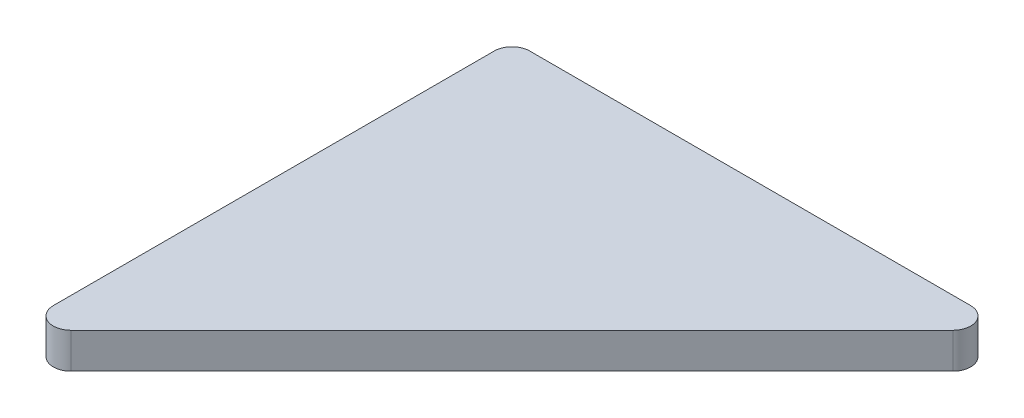
ISO-10303-21;
HEADER;
FILE_DESCRIPTION(('STEP AP214'),'2;1');
FILE_NAME('part.step','',(''),(''),'','','');
FILE_SCHEMA(('AUTOMOTIVE_DESIGN { 1 0 10303 214 1 1 1 1 }'));
ENDSEC;
DATA;
#1=APPLICATION_CONTEXT('core data for automotive mechanical design processes');
#2=APPLICATION_PROTOCOL_DEFINITION('international standard','automotive_design',2000,#1);
#3=PRODUCT_CONTEXT('',#1,'mechanical');
#4=PRODUCT('Part','Part','',(#3));
#5=PRODUCT_RELATED_PRODUCT_CATEGORY('part','',(#4));
#6=PRODUCT_DEFINITION_FORMATION('','',#4);
#7=PRODUCT_DEFINITION_CONTEXT('part definition',#1,'design');
#8=PRODUCT_DEFINITION('design','',#6,#7);
#9=PRODUCT_DEFINITION_SHAPE('','',#8);
#10=(LENGTH_UNIT() NAMED_UNIT(*) SI_UNIT(.MILLI.,.METRE.));
#11=(NAMED_UNIT(*) PLANE_ANGLE_UNIT() SI_UNIT($,.RADIAN.));
#12=(NAMED_UNIT(*) SI_UNIT($,.STERADIAN.) SOLID_ANGLE_UNIT());
#13=UNCERTAINTY_MEASURE_WITH_UNIT(LENGTH_MEASURE(1.E-05),#10,'distance_accuracy_value','');
#14=(GEOMETRIC_REPRESENTATION_CONTEXT(3) GLOBAL_UNCERTAINTY_ASSIGNED_CONTEXT((#13)) GLOBAL_UNIT_ASSIGNED_CONTEXT((#10,
#11,#12)) REPRESENTATION_CONTEXT('',''));
#15=CARTESIAN_POINT('',(0.,0.,0.));
#16=DIRECTION('',(0.,0.,1.));
#17=DIRECTION('',(1.,0.,0.));
#18=AXIS2_PLACEMENT_3D('',#15,#16,#17);
#19=CARTESIAN_POINT('',(5.,-10.,5.));
#20=DIRECTION('',(0.,1.,0.));
#21=DIRECTION('',(0.,0.,1.));
#22=AXIS2_PLACEMENT_3D('',#19,#20,#21);
#23=CYLINDRICAL_SURFACE('',#22,5.);
#24=CARTESIAN_POINT('',(5.,0.,5.));
#25=DIRECTION('',(0.,1.,0.));
#26=DIRECTION('',(0.,0.,1.));
#27=AXIS2_PLACEMENT_3D('',#24,#25,#26);
#28=CIRCLE('',#27,5.);
#29=CARTESIAN_POINT('',(5.00000000000004,0.,0.));
#30=VERTEX_POINT('',#29);
#31=CARTESIAN_POINT('',(0.,0.,5.00000000000004));
#32=VERTEX_POINT('',#31);
#33=EDGE_CURVE('E130',#30,#32,#28,.T.);
#34=ORIENTED_EDGE('',*,*,#33,.F.);
#35=DIRECTION('',(0.,1.,0.));
#36=VECTOR('',#35,1.);
#37=CARTESIAN_POINT('',(5.00000000000004,-10.,0.));
#38=LINE('',#37,#36);
#39=CARTESIAN_POINT('',(5.00000000000004,-10.,0.));
#40=VERTEX_POINT('',#39);
#41=EDGE_CURVE('E11',#40,#30,#38,.T.);
#42=ORIENTED_EDGE('',*,*,#41,.F.);
#43=CARTESIAN_POINT('',(5.,-10.,5.));
#44=DIRECTION('',(0.,1.,0.));
#45=DIRECTION('',(0.,0.,1.));
#46=AXIS2_PLACEMENT_3D('',#43,#44,#45);
#47=CIRCLE('',#46,5.);
#48=CARTESIAN_POINT('',(0.,-10.,5.00000000000004));
#49=VERTEX_POINT('',#48);
#50=EDGE_CURVE('E150',#40,#49,#47,.T.);
#51=ORIENTED_EDGE('',*,*,#50,.T.);
#52=DIRECTION('',(0.,1.,0.));
#53=VECTOR('',#52,1.);
#54=CARTESIAN_POINT('',(0.,-10.,5.00000000000004));
#55=LINE('',#54,#53);
#56=EDGE_CURVE('E42',#49,#32,#55,.T.);
#57=ORIENTED_EDGE('',*,*,#56,.T.);
#58=EDGE_LOOP('',(#34,#42,#51,#57));
#59=FACE_BOUND('',#58,.T.);
#60=ADVANCED_FACE('F39',(#59),#23,.T.);
#61=CARTESIAN_POINT('',(129.350288425444,-10.,0.));
#62=DIRECTION('',(0.,0.,-1.));
#63=DIRECTION('',(-1.,0.,0.));
#64=AXIS2_PLACEMENT_3D('',#61,#62,#63);
#65=PLANE('',#64);
#66=DIRECTION('',(-1.,0.,0.));
#67=VECTOR('',#66,1.);
#68=CARTESIAN_POINT('',(129.350288425444,0.,0.));
#69=LINE('',#68,#67);
#70=CARTESIAN_POINT('',(129.350288425444,0.,0.));
#71=VERTEX_POINT('',#70);
#72=EDGE_CURVE('E147',#71,#30,#69,.T.);
#73=ORIENTED_EDGE('',*,*,#72,.F.);
#74=DIRECTION('',(0.,1.,0.));
#75=VECTOR('',#74,1.);
#76=CARTESIAN_POINT('',(129.350288425444,-10.,0.));
#77=LINE('',#76,#75);
#78=CARTESIAN_POINT('',(129.350288425444,-10.,0.));
#79=VERTEX_POINT('',#78);
#80=EDGE_CURVE('E49',#79,#71,#77,.T.);
#81=ORIENTED_EDGE('',*,*,#80,.F.);
#82=DIRECTION('',(-1.,0.,0.));
#83=VECTOR('',#82,1.);
#84=CARTESIAN_POINT('',(129.350288425444,-10.,0.));
#85=LINE('',#84,#83);
#86=EDGE_CURVE('E116',#79,#40,#85,.T.);
#87=ORIENTED_EDGE('',*,*,#86,.T.);
#88=ORIENTED_EDGE('',*,*,#41,.T.);
#89=EDGE_LOOP('',(#73,#81,#87,#88));
#90=FACE_BOUND('',#89,.T.);
#91=ADVANCED_FACE('F162',(#90),#65,.T.);
#92=CARTESIAN_POINT('',(129.350288425444,-10.,5.));
#93=DIRECTION('',(0.,1.,0.));
#94=DIRECTION('',(0.,0.,1.));
#95=AXIS2_PLACEMENT_3D('',#92,#93,#94);
#96=CYLINDRICAL_SURFACE('',#95,4.99999999999997);
#97=CARTESIAN_POINT('',(129.350288425444,0.,5.));
#98=DIRECTION('',(0.,1.,0.));
#99=DIRECTION('',(0.,0.,1.));
#100=AXIS2_PLACEMENT_3D('',#97,#98,#99);
#101=CIRCLE('',#100,4.99999999999997);
#102=CARTESIAN_POINT('',(132.885822331377,0.,8.53553390593272));
#103=VERTEX_POINT('',#102);
#104=EDGE_CURVE('E102',#103,#71,#101,.T.);
#105=ORIENTED_EDGE('',*,*,#104,.F.);
#106=DIRECTION('',(0.,1.,0.));
#107=VECTOR('',#106,1.);
#108=CARTESIAN_POINT('',(132.885822331377,-10.,8.53553390593272));
#109=LINE('',#108,#107);
#110=CARTESIAN_POINT('',(132.885822331377,-10.,8.53553390593272));
#111=VERTEX_POINT('',#110);
#112=EDGE_CURVE('E97',#111,#103,#109,.T.);
#113=ORIENTED_EDGE('',*,*,#112,.F.);
#114=CARTESIAN_POINT('',(129.350288425444,-10.,5.));
#115=DIRECTION('',(0.,1.,0.));
#116=DIRECTION('',(0.,0.,1.));
#117=AXIS2_PLACEMENT_3D('',#114,#115,#116);
#118=CIRCLE('',#117,4.99999999999997);
#119=EDGE_CURVE('E100',#111,#79,#118,.T.);
#120=ORIENTED_EDGE('',*,*,#119,.T.);
#121=ORIENTED_EDGE('',*,*,#80,.T.);
#122=EDGE_LOOP('',(#105,#113,#120,#121));
#123=FACE_BOUND('',#122,.T.);
#124=ADVANCED_FACE('F99',(#123),#96,.T.);
#125=CARTESIAN_POINT('',(8.53553390593273,-10.,132.885822331377));
#126=DIRECTION('',(0.707106781186548,0.,0.707106781186547));
#127=DIRECTION('',(0.707106781186547,0.,-0.707106781186548));
#128=AXIS2_PLACEMENT_3D('',#125,#126,#127);
#129=PLANE('',#128);
#130=DIRECTION('',(0.707106781186547,0.,-0.707106781186548));
#131=VECTOR('',#130,1.);
#132=CARTESIAN_POINT('',(8.53553390593273,0.,132.885822331377));
#133=LINE('',#132,#131);
#134=CARTESIAN_POINT('',(8.53553390593273,0.,132.885822331377));
#135=VERTEX_POINT('',#134);
#136=EDGE_CURVE('E142',#135,#103,#133,.T.);
#137=ORIENTED_EDGE('',*,*,#136,.F.);
#138=DIRECTION('',(0.,1.,0.));
#139=VECTOR('',#138,1.);
#140=CARTESIAN_POINT('',(8.53553390593273,-10.,132.885822331377));
#141=LINE('',#140,#139);
#142=CARTESIAN_POINT('',(8.53553390593273,-10.,132.885822331377));
#143=VERTEX_POINT('',#142);
#144=EDGE_CURVE('E108',#143,#135,#141,.T.);
#145=ORIENTED_EDGE('',*,*,#144,.F.);
#146=DIRECTION('',(0.707106781186547,0.,-0.707106781186548));
#147=VECTOR('',#146,1.);
#148=CARTESIAN_POINT('',(8.53553390593273,-10.,132.885822331377));
#149=LINE('',#148,#147);
#150=EDGE_CURVE('E114',#143,#111,#149,.T.);
#151=ORIENTED_EDGE('',*,*,#150,.T.);
#152=ORIENTED_EDGE('',*,*,#112,.T.);
#153=EDGE_LOOP('',(#137,#145,#151,#152));
#154=FACE_BOUND('',#153,.T.);
#155=ADVANCED_FACE('F119',(#154),#129,.T.);
#156=CARTESIAN_POINT('',(5.,-10.,129.350288425444));
#157=DIRECTION('',(0.,1.,0.));
#158=DIRECTION('',(0.,0.,1.));
#159=AXIS2_PLACEMENT_3D('',#156,#157,#158);
#160=CYLINDRICAL_SURFACE('',#159,4.99999999999999);
#161=CARTESIAN_POINT('',(5.,0.,129.350288425444));
#162=DIRECTION('',(0.,1.,0.));
#163=DIRECTION('',(0.,0.,-1.));
#164=AXIS2_PLACEMENT_3D('',#161,#162,#163);
#165=CIRCLE('',#164,4.99999999999999);
#166=CARTESIAN_POINT('',(0.,0.,129.350288425444));
#167=VERTEX_POINT('',#166);
#168=EDGE_CURVE('E138',#167,#135,#165,.T.);
#169=ORIENTED_EDGE('',*,*,#168,.F.);
#170=DIRECTION('',(0.,1.,0.));
#171=VECTOR('',#170,1.);
#172=CARTESIAN_POINT('',(0.,-10.,129.350288425444));
#173=LINE('',#172,#171);
#174=CARTESIAN_POINT('',(0.,-10.,129.350288425444));
#175=VERTEX_POINT('',#174);
#176=EDGE_CURVE('E155',#175,#167,#173,.T.);
#177=ORIENTED_EDGE('',*,*,#176,.F.);
#178=CARTESIAN_POINT('',(5.,-10.,129.350288425444));
#179=DIRECTION('',(0.,1.,0.));
#180=DIRECTION('',(0.,0.,-1.));
#181=AXIS2_PLACEMENT_3D('',#178,#179,#180);
#182=CIRCLE('',#181,4.99999999999999);
#183=EDGE_CURVE('E121',#175,#143,#182,.T.);
#184=ORIENTED_EDGE('',*,*,#183,.T.);
#185=ORIENTED_EDGE('',*,*,#144,.T.);
#186=EDGE_LOOP('',(#169,#177,#184,#185));
#187=FACE_BOUND('',#186,.T.);
#188=ADVANCED_FACE('F175',(#187),#160,.T.);
#189=CARTESIAN_POINT('',(0.,-10.,5.00000000000004));
#190=DIRECTION('',(-1.,0.,0.));
#191=DIRECTION('',(0.,0.,1.));
#192=AXIS2_PLACEMENT_3D('',#189,#190,#191);
#193=PLANE('',#192);
#194=DIRECTION('',(0.,0.,1.));
#195=VECTOR('',#194,1.);
#196=CARTESIAN_POINT('',(0.,0.,5.00000000000004));
#197=LINE('',#196,#195);
#198=EDGE_CURVE('E134',#32,#167,#197,.T.);
#199=ORIENTED_EDGE('',*,*,#198,.F.);
#200=ORIENTED_EDGE('',*,*,#56,.F.);
#201=DIRECTION('',(0.,0.,1.));
#202=VECTOR('',#201,1.);
#203=CARTESIAN_POINT('',(0.,-10.,5.00000000000004));
#204=LINE('',#203,#202);
#205=EDGE_CURVE('E124',#49,#175,#204,.T.);
#206=ORIENTED_EDGE('',*,*,#205,.T.);
#207=ORIENTED_EDGE('',*,*,#176,.T.);
#208=EDGE_LOOP('',(#199,#200,#206,#207));
#209=FACE_BOUND('',#208,.T.);
#210=ADVANCED_FACE('F159',(#209),#193,.T.);
#211=CARTESIAN_POINT('',(5.,-10.,5.));
#212=DIRECTION('',(0.,1.,0.));
#213=DIRECTION('',(0.,0.,1.));
#214=AXIS2_PLACEMENT_3D('',#211,#212,#213);
#215=PLANE('',#214);
#216=ORIENTED_EDGE('',*,*,#50,.F.);
#217=ORIENTED_EDGE('',*,*,#86,.F.);
#218=ORIENTED_EDGE('',*,*,#119,.F.);
#219=ORIENTED_EDGE('',*,*,#150,.F.);
#220=ORIENTED_EDGE('',*,*,#183,.F.);
#221=ORIENTED_EDGE('',*,*,#205,.F.);
#222=EDGE_LOOP('',(#216,#217,#218,#219,#220,#221));
#223=FACE_BOUND('',#222,.T.);
#224=ADVANCED_FACE('F112',(#223),#215,.F.);
#225=CARTESIAN_POINT('',(5.,0.,5.));
#226=DIRECTION('',(0.,1.,0.));
#227=DIRECTION('',(0.,0.,1.));
#228=AXIS2_PLACEMENT_3D('',#225,#226,#227);
#229=PLANE('',#228);
#230=ORIENTED_EDGE('',*,*,#33,.T.);
#231=ORIENTED_EDGE('',*,*,#198,.T.);
#232=ORIENTED_EDGE('',*,*,#168,.T.);
#233=ORIENTED_EDGE('',*,*,#136,.T.);
#234=ORIENTED_EDGE('',*,*,#104,.T.);
#235=ORIENTED_EDGE('',*,*,#72,.T.);
#236=EDGE_LOOP('',(#230,#231,#232,#233,#234,#235));
#237=FACE_BOUND('',#236,.T.);
#238=ADVANCED_FACE('F161',(#237),#229,.T.);
#239=CLOSED_SHELL('',(#60,#91,#124,#155,#188,#210,#224,#238));
#240=MANIFOLD_SOLID_BREP('B2',#239);
#241=ADVANCED_BREP_SHAPE_REPRESENTATION('',(#18,#240),#14);
#242=SHAPE_DEFINITION_REPRESENTATION(#9,#241);
ENDSEC;
END-ISO-10303-21;
